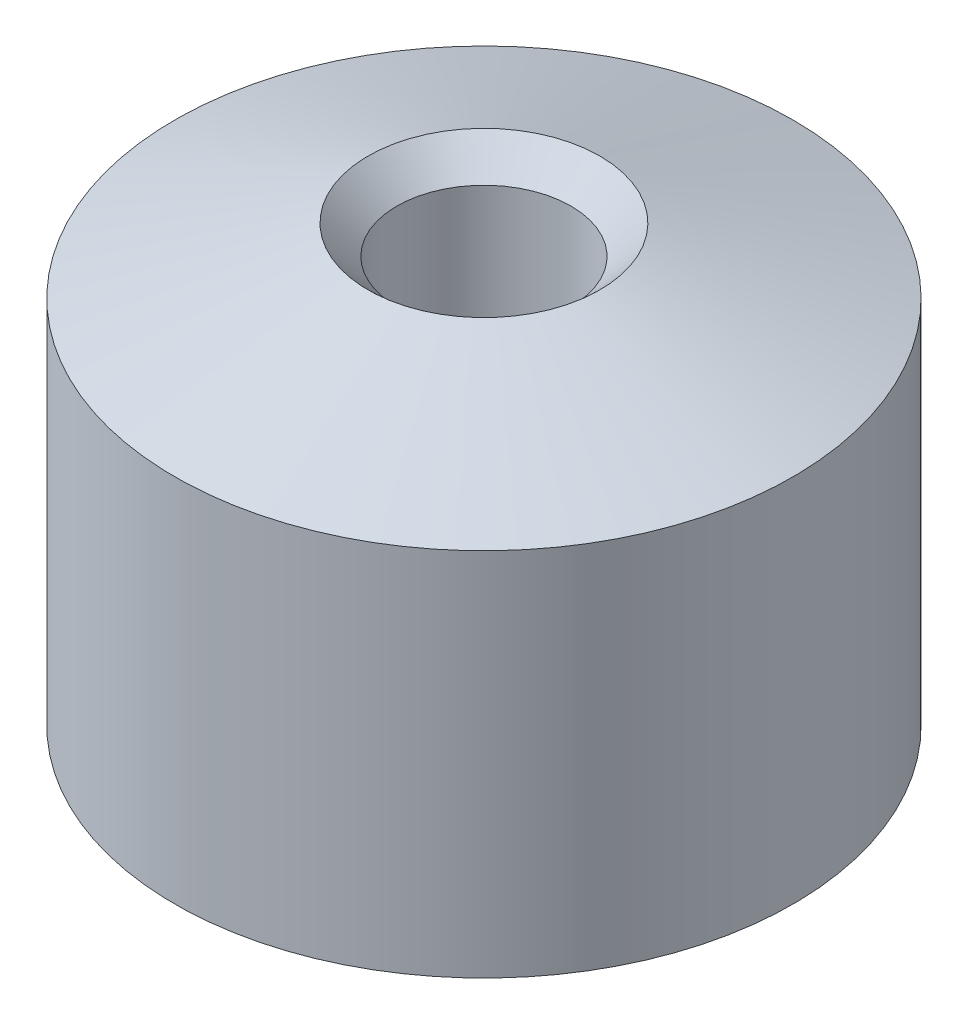
ISO-10303-21;
HEADER;
FILE_DESCRIPTION(('STEP AP214'),'2;1');
FILE_NAME('part.step','',(''),(''),'','','');
FILE_SCHEMA(('AUTOMOTIVE_DESIGN { 1 0 10303 214 1 1 1 1 }'));
ENDSEC;
DATA;
#1=APPLICATION_CONTEXT('core data for automotive mechanical design processes');
#2=APPLICATION_PROTOCOL_DEFINITION('international standard','automotive_design',2000,#1);
#3=PRODUCT_CONTEXT('',#1,'mechanical');
#4=PRODUCT('Part','Part','',(#3));
#5=PRODUCT_RELATED_PRODUCT_CATEGORY('part','',(#4));
#6=PRODUCT_DEFINITION_FORMATION('','',#4);
#7=PRODUCT_DEFINITION_CONTEXT('part definition',#1,'design');
#8=PRODUCT_DEFINITION('design','',#6,#7);
#9=PRODUCT_DEFINITION_SHAPE('','',#8);
#10=(LENGTH_UNIT() NAMED_UNIT(*) SI_UNIT(.MILLI.,.METRE.));
#11=(NAMED_UNIT(*) PLANE_ANGLE_UNIT() SI_UNIT($,.RADIAN.));
#12=(NAMED_UNIT(*) SI_UNIT($,.STERADIAN.) SOLID_ANGLE_UNIT());
#13=UNCERTAINTY_MEASURE_WITH_UNIT(LENGTH_MEASURE(1.E-05),#10,'distance_accuracy_value','');
#14=(GEOMETRIC_REPRESENTATION_CONTEXT(3) GLOBAL_UNCERTAINTY_ASSIGNED_CONTEXT((#13)) GLOBAL_UNIT_ASSIGNED_CONTEXT((#10,
#11,#12)) REPRESENTATION_CONTEXT('',''));
#15=CARTESIAN_POINT('',(0.,0.,0.));
#16=DIRECTION('',(0.,0.,1.));
#17=DIRECTION('',(1.,0.,0.));
#18=AXIS2_PLACEMENT_3D('',#15,#16,#17);
#19=CARTESIAN_POINT('',(0.,15.2,0.));
#20=DIRECTION('',(0.,-1.,0.));
#21=DIRECTION('',(0.,0.,-1.));
#22=AXIS2_PLACEMENT_3D('',#19,#20,#21);
#23=CYLINDRICAL_SURFACE('',#22,14.2);
#24=CARTESIAN_POINT('',(0.,18.5,0.));
#25=DIRECTION('',(0.,-1.,0.));
#26=DIRECTION('',(0.,0.,-1.));
#27=AXIS2_PLACEMENT_3D('',#24,#25,#26);
#28=CIRCLE('',#27,14.2);
#29=CARTESIAN_POINT('',(0.,18.5,-14.2));
#30=VERTEX_POINT('',#29);
#31=EDGE_CURVE('E48',#30,#30,#28,.T.);
#32=ORIENTED_EDGE('',*,*,#31,.F.);
#33=EDGE_LOOP('',(#32));
#34=FACE_BOUND('',#33,.T.);
#35=CARTESIAN_POINT('',(0.,35.5,0.));
#36=DIRECTION('',(0.,-1.,0.));
#37=DIRECTION('',(0.,0.,-1.));
#38=AXIS2_PLACEMENT_3D('',#35,#36,#37);
#39=CIRCLE('',#38,14.2);
#40=CARTESIAN_POINT('',(0.,35.5,-14.2));
#41=VERTEX_POINT('',#40);
#42=EDGE_CURVE('E10',#41,#41,#39,.T.);
#43=ORIENTED_EDGE('',*,*,#42,.T.);
#44=EDGE_LOOP('',(#43));
#45=FACE_BOUND('',#44,.T.);
#46=ADVANCED_FACE('F29',(#34,#45),#23,.T.);
#47=CARTESIAN_POINT('',(0.,38.5,0.));
#48=DIRECTION('',(0.,-1.,0.));
#49=DIRECTION('',(0.,0.,-1.));
#50=AXIS2_PLACEMENT_3D('',#47,#48,#49);
#51=CONICAL_SURFACE('',#50,5.32658572705139,1.24477217622328);
#52=ORIENTED_EDGE('',*,*,#42,.F.);
#53=EDGE_LOOP('',(#52));
#54=FACE_BOUND('',#53,.T.);
#55=CARTESIAN_POINT('',(0.,38.5,0.));
#56=DIRECTION('',(0.,-1.,0.));
#57=DIRECTION('',(0.,0.,-1.));
#58=AXIS2_PLACEMENT_3D('',#55,#56,#57);
#59=CIRCLE('',#58,5.32658572705139);
#60=CARTESIAN_POINT('',(0.,38.5,-5.32658572705139));
#61=VERTEX_POINT('',#60);
#62=EDGE_CURVE('E35',#61,#61,#59,.T.);
#63=ORIENTED_EDGE('',*,*,#62,.T.);
#64=EDGE_LOOP('',(#63));
#65=FACE_BOUND('',#64,.T.);
#66=ADVANCED_FACE('F55',(#54,#65),#51,.T.);
#67=CARTESIAN_POINT('',(0.,37.1734142729486,0.));
#68=DIRECTION('',(0.,1.,0.));
#69=DIRECTION('',(0.,0.,1.));
#70=AXIS2_PLACEMENT_3D('',#67,#68,#69);
#71=CONICAL_SURFACE('',#70,4.,0.785398163397454);
#72=ORIENTED_EDGE('',*,*,#62,.F.);
#73=EDGE_LOOP('',(#72));
#74=FACE_BOUND('',#73,.T.);
#75=CARTESIAN_POINT('',(0.,37.1734142729486,0.));
#76=DIRECTION('',(0.,-1.,0.));
#77=DIRECTION('',(0.,0.,-1.));
#78=AXIS2_PLACEMENT_3D('',#75,#76,#77);
#79=CIRCLE('',#78,4.);
#80=CARTESIAN_POINT('',(0.,37.1734142729486,-4.));
#81=VERTEX_POINT('',#80);
#82=EDGE_CURVE('E39',#81,#81,#79,.T.);
#83=ORIENTED_EDGE('',*,*,#82,.T.);
#84=EDGE_LOOP('',(#83));
#85=FACE_BOUND('',#84,.T.);
#86=ADVANCED_FACE('F59',(#74,#85),#71,.F.);
#87=CARTESIAN_POINT('',(0.,15.2,0.));
#88=DIRECTION('',(0.,-1.,0.));
#89=DIRECTION('',(0.,0.,-1.));
#90=AXIS2_PLACEMENT_3D('',#87,#88,#89);
#91=CYLINDRICAL_SURFACE('',#90,4.);
#92=ORIENTED_EDGE('',*,*,#82,.F.);
#93=EDGE_LOOP('',(#92));
#94=FACE_BOUND('',#93,.T.);
#95=CARTESIAN_POINT('',(0.,18.5,0.));
#96=DIRECTION('',(0.,-1.,0.));
#97=DIRECTION('',(0.,0.,-1.));
#98=AXIS2_PLACEMENT_3D('',#95,#96,#97);
#99=CIRCLE('',#98,4.);
#100=CARTESIAN_POINT('',(0.,18.5,-4.));
#101=VERTEX_POINT('',#100);
#102=EDGE_CURVE('E43',#101,#101,#99,.T.);
#103=ORIENTED_EDGE('',*,*,#102,.T.);
#104=EDGE_LOOP('',(#103));
#105=FACE_BOUND('',#104,.T.);
#106=ADVANCED_FACE('F64',(#94,#105),#91,.F.);
#107=CARTESIAN_POINT('',(-14.2,18.5,0.));
#108=DIRECTION('',(0.,1.,0.));
#109=DIRECTION('',(0.,0.,1.));
#110=AXIS2_PLACEMENT_3D('',#107,#108,#109);
#111=PLANE('',#110);
#112=ORIENTED_EDGE('',*,*,#102,.F.);
#113=EDGE_LOOP('',(#112));
#114=FACE_BOUND('',#113,.T.);
#115=ORIENTED_EDGE('',*,*,#31,.T.);
#116=EDGE_LOOP('',(#115));
#117=FACE_BOUND('',#116,.T.);
#118=ADVANCED_FACE('F52',(#114,#117),#111,.F.);
#119=CLOSED_SHELL('',(#46,#66,#86,#106,#118));
#120=MANIFOLD_SOLID_BREP('B2',#119);
#121=ADVANCED_BREP_SHAPE_REPRESENTATION('',(#18,#120),#14);
#122=SHAPE_DEFINITION_REPRESENTATION(#9,#121);
ENDSEC;
END-ISO-10303-21;
